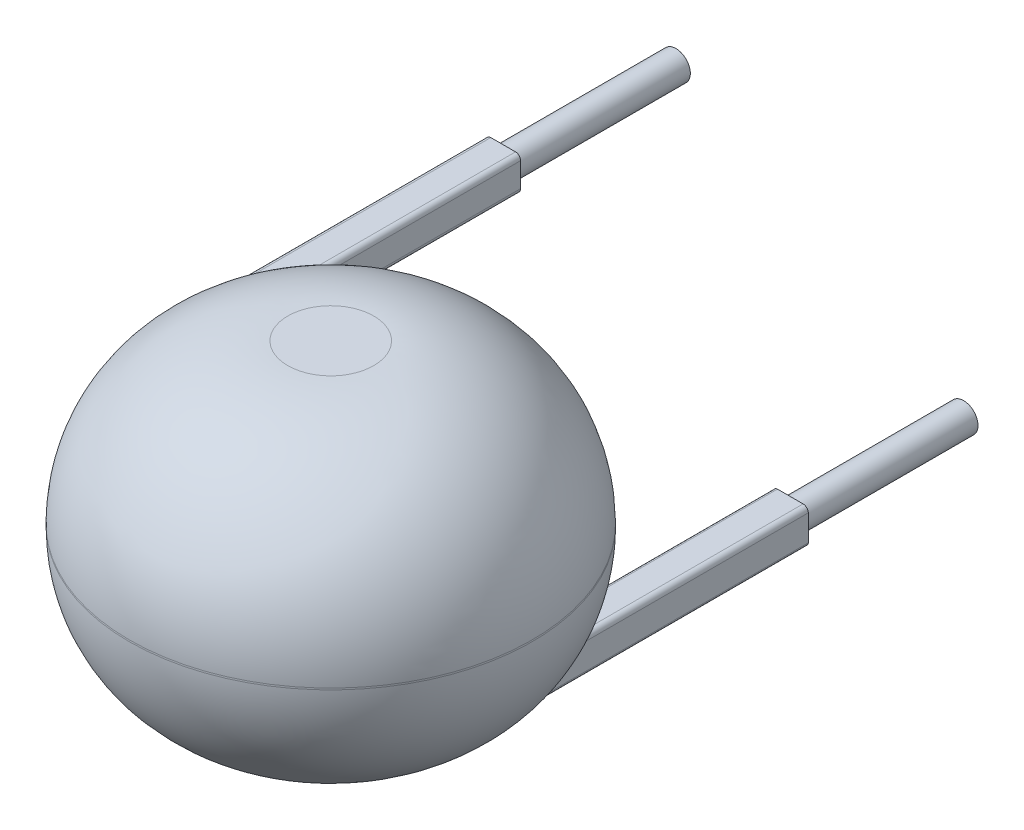
ISO-10303-21;
HEADER;
FILE_DESCRIPTION(('STEP AP214'),'2;1');
FILE_NAME('part.step','',(''),(''),'','','');
FILE_SCHEMA(('AUTOMOTIVE_DESIGN { 1 0 10303 214 1 1 1 1 }'));
ENDSEC;
DATA;
#1=APPLICATION_CONTEXT('core data for automotive mechanical design processes');
#2=APPLICATION_PROTOCOL_DEFINITION('international standard','automotive_design',2000,#1);
#3=PRODUCT_CONTEXT('',#1,'mechanical');
#4=PRODUCT('Part','Part','',(#3));
#5=PRODUCT_RELATED_PRODUCT_CATEGORY('part','',(#4));
#6=PRODUCT_DEFINITION_FORMATION('','',#4);
#7=PRODUCT_DEFINITION_CONTEXT('part definition',#1,'design');
#8=PRODUCT_DEFINITION('design','',#6,#7);
#9=PRODUCT_DEFINITION_SHAPE('','',#8);
#10=(LENGTH_UNIT() NAMED_UNIT(*) SI_UNIT(.MILLI.,.METRE.));
#11=(NAMED_UNIT(*) PLANE_ANGLE_UNIT() SI_UNIT($,.RADIAN.));
#12=(NAMED_UNIT(*) SI_UNIT($,.STERADIAN.) SOLID_ANGLE_UNIT());
#13=UNCERTAINTY_MEASURE_WITH_UNIT(LENGTH_MEASURE(1.E-05),#10,'distance_accuracy_value','');
#14=(GEOMETRIC_REPRESENTATION_CONTEXT(3) GLOBAL_UNCERTAINTY_ASSIGNED_CONTEXT((#13)) GLOBAL_UNIT_ASSIGNED_CONTEXT((#10,
#11,#12)) REPRESENTATION_CONTEXT('',''));
#15=CARTESIAN_POINT('',(0.,0.,0.));
#16=DIRECTION('',(0.,0.,1.));
#17=DIRECTION('',(1.,0.,0.));
#18=AXIS2_PLACEMENT_3D('',#15,#16,#17);
#19=CARTESIAN_POINT('',(2.265265,-1.1,3.));
#20=DIRECTION('',(0.,1.,0.));
#21=DIRECTION('',(0.,0.,1.));
#22=AXIS2_PLACEMENT_3D('',#19,#20,#21);
#23=PLANE('',#22);
#24=CARTESIAN_POINT('',(0.,-1.1,8.5));
#25=DIRECTION('',(0.,-1.,0.));
#26=DIRECTION('',(1.,0.,0.));
#27=AXIS2_PLACEMENT_3D('',#24,#25,#26);
#28=CIRCLE('',#27,3.28098746596916);
#29=CARTESIAN_POINT('',(2.26526500000004,-1.1,6.12651032620288));
#30=VERTEX_POINT('',#29);
#31=CARTESIAN_POINT('',(2.710115,-1.1,6.65063377379681));
#32=VERTEX_POINT('',#31);
#33=EDGE_CURVE('E19',#30,#32,#28,.T.);
#34=ORIENTED_EDGE('',*,*,#33,.T.);
#35=DIRECTION('',(0.,0.,-1.));
#36=VECTOR('',#35,1.);
#37=CARTESIAN_POINT('',(2.710115,-1.1,3.));
#38=LINE('',#37,#36);
#39=CARTESIAN_POINT('',(2.710115,-1.1,3.));
#40=VERTEX_POINT('',#39);
#41=EDGE_CURVE('E142',#40,#32,#38,.F.);
#42=ORIENTED_EDGE('',*,*,#41,.F.);
#43=DIRECTION('',(1.,0.,0.));
#44=VECTOR('',#43,1.);
#45=CARTESIAN_POINT('',(2.265265,-1.1,3.));
#46=LINE('',#45,#44);
#47=CARTESIAN_POINT('',(2.265265,-1.1,3.));
#48=VERTEX_POINT('',#47);
#49=EDGE_CURVE('E146',#40,#48,#46,.F.);
#50=ORIENTED_EDGE('',*,*,#49,.T.);
#51=DIRECTION('',(0.,0.,-1.));
#52=VECTOR('',#51,1.);
#53=CARTESIAN_POINT('',(2.265265,-1.1,3.));
#54=LINE('',#53,#52);
#55=EDGE_CURVE('E145',#30,#48,#54,.T.);
#56=ORIENTED_EDGE('',*,*,#55,.F.);
#57=EDGE_LOOP('',(#34,#42,#50,#56));
#58=FACE_BOUND('',#57,.T.);
#59=ADVANCED_FACE('F16',(#58),#23,.T.);
#60=CARTESIAN_POINT('',(2.75,-1.4,0.));
#61=DIRECTION('',(0.,0.,1.));
#62=DIRECTION('',(1.,0.,0.));
#63=AXIS2_PLACEMENT_3D('',#60,#61,#62);
#64=PLANE('',#63);
#65=CARTESIAN_POINT('',(2.5,-1.4,0.));
#66=DIRECTION('',(0.,0.,1.));
#67=DIRECTION('',(1.,0.,0.));
#68=AXIS2_PLACEMENT_3D('',#65,#66,#67);
#69=CIRCLE('',#68,0.25);
#70=CARTESIAN_POINT('',(2.75,-1.4,0.));
#71=VERTEX_POINT('',#70);
#72=EDGE_CURVE('E594',#71,#71,#69,.T.);
#73=ORIENTED_EDGE('',*,*,#72,.F.);
#74=EDGE_LOOP('',(#73));
#75=FACE_BOUND('',#74,.T.);
#76=ADVANCED_FACE('F548',(#75),#64,.F.);
#77=CARTESIAN_POINT('',(2.710115,-1.189885,3.));
#78=DIRECTION('',(0.,0.,-1.));
#79=DIRECTION('',(-1.,0.,0.));
#80=AXIS2_PLACEMENT_3D('',#77,#78,#79);
#81=CYLINDRICAL_SURFACE('',#80,0.089885);
#82=DIRECTION('',(0.,0.,-1.));
#83=VECTOR('',#82,1.);
#84=CARTESIAN_POINT('',(2.8,-1.189885,3.));
#85=LINE('',#84,#83);
#86=CARTESIAN_POINT('',(2.8,-1.189885,3.));
#87=VERTEX_POINT('',#86);
#88=CARTESIAN_POINT('',(2.8,-1.18988500000005,6.86857842440395));
#89=VERTEX_POINT('',#88);
#90=EDGE_CURVE('E597',#87,#89,#85,.F.);
#91=ORIENTED_EDGE('',*,*,#90,.F.);
#92=CARTESIAN_POINT('',(2.710115,-1.189885,3.));
#93=DIRECTION('',(0.,0.,-1.));
#94=DIRECTION('',(-1.,0.,0.));
#95=AXIS2_PLACEMENT_3D('',#92,#93,#94);
#96=CIRCLE('',#95,0.089885);
#97=EDGE_CURVE('E141',#87,#40,#96,.F.);
#98=ORIENTED_EDGE('',*,*,#97,.T.);
#99=ORIENTED_EDGE('',*,*,#41,.T.);
#100=CARTESIAN_POINT('',(2.71011500000017,-1.1,6.65063377379688));
#101=CARTESIAN_POINT('',(2.71498028899243,-1.10000774236478,6.6577694744777));
#102=CARTESIAN_POINT('',(2.71967655665813,-1.10039388554111,6.66500484150084));
#103=CARTESIAN_POINT('',(2.7287413549297,-1.10182979718225,6.67961959139926));
#104=CARTESIAN_POINT('',(2.73310974726967,-1.10287984387745,6.68699903339666));
#105=CARTESIAN_POINT('',(2.74706667791884,-1.10730872404726,6.71161397500613));
#106=CARTESIAN_POINT('',(2.75595295442842,-1.11193325680277,6.72902993672954));
#107=CARTESIAN_POINT('',(2.77190961848127,-1.12384894087521,6.76388076281297));
#108=CARTESIAN_POINT('',(2.77897320013423,-1.13114984702747,6.78131546070197));
#109=CARTESIAN_POINT('',(2.78805226360753,-1.14473766152052,6.80781575464605));
#110=CARTESIAN_POINT('',(2.79090958566138,-1.15000486169995,6.81712011583291));
#111=CARTESIAN_POINT('',(2.79565404013966,-1.16157150091445,6.83526444914789));
#112=CARTESIAN_POINT('',(2.79754873827161,-1.16786236056528,6.84410753649104));
#113=CARTESIAN_POINT('',(2.79912683320544,-1.17716883805135,6.85529602436851));
#114=CARTESIAN_POINT('',(2.79944293226079,-1.179581668201,6.85805294304374));
#115=CARTESIAN_POINT('',(2.79987919894188,-1.18459149551493,6.86343162269824));
#116=CARTESIAN_POINT('',(2.79999852120719,-1.18718923752436,6.86605275391414));
#117=CARTESIAN_POINT('',(2.8,-1.18988500000009,6.8685784244039));
#118=B_SPLINE_CURVE_WITH_KNOTS('',3,(#100,#101,#102,#103,#104,#105,#106,#107,#108,#109,#110,
#111,#112,#113,#114,#115,#116,#117),.UNSPECIFIED.,.F.,.F.,(4,2,2,2,2,2,2,2,4),(0.,
0.0258792798324099,0.0517694124150034,0.111757943384605,0.17196733027596,0.205108797888413,
0.237985597659175,0.249006765659486,0.260075158826563),.UNSPECIFIED.);
#119=EDGE_CURVE('E130',#32,#89,#118,.T.);
#120=ORIENTED_EDGE('',*,*,#119,.T.);
#121=EDGE_LOOP('',(#91,#98,#99,#120));
#122=FACE_BOUND('',#121,.T.);
#123=ADVANCED_FACE('F148',(#122),#81,.T.);
#124=CARTESIAN_POINT('',(2.265265,-1.165265,3.));
#125=DIRECTION('',(0.,0.,-1.));
#126=DIRECTION('',(-1.,0.,0.));
#127=AXIS2_PLACEMENT_3D('',#124,#125,#126);
#128=CYLINDRICAL_SURFACE('',#127,0.065265);
#129=ORIENTED_EDGE('',*,*,#55,.T.);
#130=CARTESIAN_POINT('',(2.265265,-1.165265,3.));
#131=DIRECTION('',(0.,0.,-1.));
#132=DIRECTION('',(-1.,0.,0.));
#133=AXIS2_PLACEMENT_3D('',#130,#131,#132);
#134=CIRCLE('',#133,0.065265);
#135=CARTESIAN_POINT('',(2.2,-1.165265,3.));
#136=VERTEX_POINT('',#135);
#137=EDGE_CURVE('E592',#48,#136,#134,.F.);
#138=ORIENTED_EDGE('',*,*,#137,.T.);
#139=DIRECTION('',(0.,0.,1.));
#140=VECTOR('',#139,1.);
#141=CARTESIAN_POINT('',(2.2,-1.165265,3.));
#142=LINE('',#141,#140);
#143=CARTESIAN_POINT('',(2.2,-1.16526500000006,6.10502936180291));
#144=VERTEX_POINT('',#143);
#145=EDGE_CURVE('E616',#144,#136,#142,.F.);
#146=ORIENTED_EDGE('',*,*,#145,.F.);
#147=CARTESIAN_POINT('',(2.2,-1.16526500000006,6.10502936180291));
#148=CARTESIAN_POINT('',(2.20000376487046,-1.16274013195119,6.10345904064927));
#149=CARTESIAN_POINT('',(2.20014824976992,-1.16015268425273,6.10198598403389));
#150=CARTESIAN_POINT('',(2.20077763472524,-1.15485766390405,6.09929218758634));
#151=CARTESIAN_POINT('',(2.20126601522262,-1.1521491305522,6.09807419409444));
#152=CARTESIAN_POINT('',(2.20333329648783,-1.14393202602417,6.09493875443286));
#153=CARTESIAN_POINT('',(2.20551427994999,-1.13833064077663,6.09353897994534));
#154=CARTESIAN_POINT('',(2.21107687070535,-1.12850833105889,6.09273161070589));
#155=CARTESIAN_POINT('',(2.21427575760491,-1.12420235806372,6.09309821754573));
#156=CARTESIAN_POINT('',(2.22114159297263,-1.11693104259928,6.09510210778626));
#157=CARTESIAN_POINT('',(2.22476205998835,-1.11389456393198,6.09665149244309));
#158=CARTESIAN_POINT('',(2.23392463518142,-1.10763382093287,6.10145562522214));
#159=CARTESIAN_POINT('',(2.23958120174379,-1.10497197061525,6.10516765419074));
#160=CARTESIAN_POINT('',(2.25212346216473,-1.10092938714992,6.1145667053594));
#161=CARTESIAN_POINT('',(2.25898279158584,-1.1000016940251,6.12051329167096));
#162=CARTESIAN_POINT('',(2.26526500000008,-1.1,6.12651032620292));
#163=B_SPLINE_CURVE_WITH_KNOTS('',3,(#147,#148,#149,#150,#151,#152,#153,#154,#155,#156,#157,
#158,#159,#160,#161,#162),.UNSPECIFIED.,.F.,.F.,(4,2,2,2,2,2,2,4),(0.,0.00891247334995725,
0.0179164676881911,0.0359199483003887,0.0516878115099389,0.0663858775080399,0.0878803583042248,
0.114468200792033),.UNSPECIFIED.);
#164=EDGE_CURVE('E125',#144,#30,#163,.T.);
#165=ORIENTED_EDGE('',*,*,#164,.T.);
#166=EDGE_LOOP('',(#129,#138,#146,#165));
#167=FACE_BOUND('',#166,.T.);
#168=ADVANCED_FACE('F531',(#167),#128,.T.);
#169=CARTESIAN_POINT('',(2.5,-1.4,3.));
#170=DIRECTION('',(0.,0.,1.));
#171=DIRECTION('',(1.,0.,0.));
#172=AXIS2_PLACEMENT_3D('',#169,#170,#171);
#173=CYLINDRICAL_SURFACE('',#172,0.25);
#174=ORIENTED_EDGE('',*,*,#72,.T.);
#175=EDGE_LOOP('',(#174));
#176=FACE_BOUND('',#175,.T.);
#177=CARTESIAN_POINT('',(2.5,-1.4,3.));
#178=DIRECTION('',(0.,0.,1.));
#179=DIRECTION('',(1.,0.,0.));
#180=AXIS2_PLACEMENT_3D('',#177,#178,#179);
#181=CIRCLE('',#180,0.25);
#182=CARTESIAN_POINT('',(2.75,-1.4,3.));
#183=VERTEX_POINT('',#182);
#184=EDGE_CURVE('E619',#183,#183,#181,.F.);
#185=ORIENTED_EDGE('',*,*,#184,.T.);
#186=EDGE_LOOP('',(#185));
#187=FACE_BOUND('',#186,.T.);
#188=ADVANCED_FACE('F522',(#176,#187),#173,.T.);
#189=CARTESIAN_POINT('',(2.8,-1.189885,3.));
#190=DIRECTION('',(1.,0.,0.));
#191=DIRECTION('',(0.,0.,-1.));
#192=AXIS2_PLACEMENT_3D('',#189,#190,#191);
#193=PLANE('',#192);
#194=CARTESIAN_POINT('',(2.8,-1.18988500000009,6.8685784244039));
#195=CARTESIAN_POINT('',(2.8,-1.21389777419375,6.89105251008016));
#196=CARTESIAN_POINT('',(2.8,-1.23730896775835,6.91416632418309));
#197=CARTESIAN_POINT('',(2.8,-1.2827256123761,6.96141182533229));
#198=CARTESIAN_POINT('',(2.8,-1.30474009612783,6.98553482676566));
#199=CARTESIAN_POINT('',(2.8,-1.34741313636841,7.03475331148148));
#200=CARTESIAN_POINT('',(2.8,-1.36807755138349,7.05984372045196));
#201=CARTESIAN_POINT('',(2.8,-1.40809219939328,7.11096101029188));
#202=CARTESIAN_POINT('',(2.8,-1.42744524833589,7.13698568827555));
#203=CARTESIAN_POINT('',(2.8,-1.46486063062107,7.18993117717473));
#204=CARTESIAN_POINT('',(2.8,-1.482923457763,7.21685163940647));
#205=CARTESIAN_POINT('',(2.8,-1.51779737860161,7.27158688294801));
#206=CARTESIAN_POINT('',(2.8,-1.53460518602446,7.29940375669741));
#207=CARTESIAN_POINT('',(2.8,-1.56698666843713,7.35592171053858));
#208=CARTESIAN_POINT('',(2.8,-1.58255409995758,7.38462636393254));
#209=CARTESIAN_POINT('',(2.8,-1.6124650041933,7.4429158076398));
#210=CARTESIAN_POINT('',(2.8,-1.62679934686158,7.47250528523241));
#211=CARTESIAN_POINT('',(2.8,-1.64045999999997,7.50240082354201));
#212=B_SPLINE_CURVE_WITH_KNOTS('',3,(#194,#195,#196,#197,#198,#199,#200,#201,#202,#203,#204,
#205,#206,#207,#208,#209,#210,#211),.UNSPECIFIED.,.F.,.F.,(4,2,2,2,2,2,2,2,4),(0.,
0.0986527756327957,0.196583682872479,0.294056702954718,0.391313308507406,0.488532489899086,
0.585997908682367,0.683926436040435,0.782526827517283),.UNSPECIFIED.);
#213=CARTESIAN_POINT('',(2.8,-1.64045999999998,7.50240082354201));
#214=VERTEX_POINT('',#213);
#215=EDGE_CURVE('E136',#89,#214,#212,.T.);
#216=ORIENTED_EDGE('',*,*,#215,.T.);
#217=DIRECTION('',(0.,0.,-1.));
#218=VECTOR('',#217,1.);
#219=CARTESIAN_POINT('',(2.8,-1.64046,3.));
#220=LINE('',#219,#218);
#221=CARTESIAN_POINT('',(2.8,-1.64046,3.));
#222=VERTEX_POINT('',#221);
#223=EDGE_CURVE('E621',#222,#214,#220,.F.);
#224=ORIENTED_EDGE('',*,*,#223,.F.);
#225=DIRECTION('',(0.,1.,0.));
#226=VECTOR('',#225,1.);
#227=CARTESIAN_POINT('',(2.8,-1.617055,3.));
#228=LINE('',#227,#226);
#229=EDGE_CURVE('E622',#222,#87,#228,.T.);
#230=ORIENTED_EDGE('',*,*,#229,.T.);
#231=ORIENTED_EDGE('',*,*,#90,.T.);
#232=EDGE_LOOP('',(#216,#224,#230,#231));
#233=FACE_BOUND('',#232,.T.);
#234=ADVANCED_FACE('F513',(#233),#193,.T.);
#235=CARTESIAN_POINT('',(2.2,-1.617055,3.));
#236=DIRECTION('',(-1.,0.,0.));
#237=DIRECTION('',(0.,0.,1.));
#238=AXIS2_PLACEMENT_3D('',#235,#236,#237);
#239=PLANE('',#238);
#240=CARTESIAN_POINT('',(2.2,-1.61705499999995,6.47600648003105));
#241=CARTESIAN_POINT('',(2.2,-1.59464872818816,6.45223729910033));
#242=CARTESIAN_POINT('',(2.2,-1.57174676819976,6.42893439388173));
#243=CARTESIAN_POINT('',(2.2,-1.52506726062348,6.38339648622144));
#244=CARTESIAN_POINT('',(2.2,-1.50129320145172,6.36115790723338));
#245=CARTESIAN_POINT('',(2.2,-1.45286701663498,6.31775084474858));
#246=CARTESIAN_POINT('',(2.2,-1.42821661191346,6.29658044222312));
#247=CARTESIAN_POINT('',(2.2,-1.37802993183403,6.25531410887796));
#248=CARTESIAN_POINT('',(2.2,-1.35249361088064,6.23521823349666));
#249=CARTESIAN_POINT('',(2.2,-1.30052762836661,6.19611501529311));
#250=CARTESIAN_POINT('',(2.2,-1.27409642748129,6.17710971730867));
#251=CARTESIAN_POINT('',(2.2,-1.22032847890549,6.1402048956233));
#252=CARTESIAN_POINT('',(2.2,-1.19298873156848,6.12230974273837));
#253=CARTESIAN_POINT('',(2.2,-1.16526500000006,6.10502936180291));
#254=B_SPLINE_CURVE_WITH_KNOTS('',3,(#240,#241,#242,#243,#244,#245,#246,#247,#248,#249,#250,
#251,#252,#253),.UNSPECIFIED.,.F.,.F.,(4,2,2,2,2,2,4),(0.,0.0979895673857979,0.195622656247312,
0.29307359497029,0.390529556667489,0.488162648521882,0.586158491795375),.UNSPECIFIED.);
#255=CARTESIAN_POINT('',(2.2,-1.61705499999995,6.47600648003105));
#256=VERTEX_POINT('',#255);
#257=EDGE_CURVE('E602',#256,#144,#254,.T.);
#258=ORIENTED_EDGE('',*,*,#257,.T.);
#259=ORIENTED_EDGE('',*,*,#145,.T.);
#260=DIRECTION('',(0.,1.,0.));
#261=VECTOR('',#260,1.);
#262=CARTESIAN_POINT('',(2.2,-1.617055,3.));
#263=LINE('',#262,#261);
#264=CARTESIAN_POINT('',(2.2,-1.617055,3.));
#265=VERTEX_POINT('',#264);
#266=EDGE_CURVE('E618',#136,#265,#263,.F.);
#267=ORIENTED_EDGE('',*,*,#266,.T.);
#268=DIRECTION('',(0.,0.,-1.));
#269=VECTOR('',#268,1.);
#270=CARTESIAN_POINT('',(2.2,-1.617055,3.));
#271=LINE('',#270,#269);
#272=EDGE_CURVE('E296',#256,#265,#271,.T.);
#273=ORIENTED_EDGE('',*,*,#272,.F.);
#274=EDGE_LOOP('',(#258,#259,#267,#273));
#275=FACE_BOUND('',#274,.T.);
#276=ADVANCED_FACE('F504',(#275),#239,.T.);
#277=CARTESIAN_POINT('',(-2.288255,1.611745,3.));
#278=DIRECTION('',(0.,0.,-1.));
#279=DIRECTION('',(-1.,0.,0.));
#280=AXIS2_PLACEMENT_3D('',#277,#278,#279);
#281=CYLINDRICAL_SURFACE('',#280,0.088255);
#282=DIRECTION('',(0.,0.,-1.));
#283=VECTOR('',#282,1.);
#284=CARTESIAN_POINT('',(-2.2,1.611745,3.));
#285=LINE('',#284,#283);
#286=CARTESIAN_POINT('',(-2.2,1.611745,3.));
#287=VERTEX_POINT('',#286);
#288=CARTESIAN_POINT('',(-2.2,1.61174499999993,6.49452209743907));
#289=VERTEX_POINT('',#288);
#290=EDGE_CURVE('E272',#287,#289,#285,.F.);
#291=ORIENTED_EDGE('',*,*,#290,.F.);
#292=CARTESIAN_POINT('',(-2.288255,1.611745,3.));
#293=DIRECTION('',(0.,0.,-1.));
#294=DIRECTION('',(-1.,0.,0.));
#295=AXIS2_PLACEMENT_3D('',#292,#293,#294);
#296=CIRCLE('',#295,0.088255);
#297=CARTESIAN_POINT('',(-2.288255,1.7,3.));
#298=VERTEX_POINT('',#297);
#299=EDGE_CURVE('E615',#287,#298,#296,.F.);
#300=ORIENTED_EDGE('',*,*,#299,.T.);
#301=DIRECTION('',(0.,0.,1.));
#302=VECTOR('',#301,1.);
#303=CARTESIAN_POINT('',(-2.288255,1.7,3.));
#304=LINE('',#303,#302);
#305=CARTESIAN_POINT('',(-2.28825499999991,1.7,6.70181499168424));
#306=VERTEX_POINT('',#305);
#307=EDGE_CURVE('E264',#306,#298,#304,.F.);
#308=ORIENTED_EDGE('',*,*,#307,.F.);
#309=CARTESIAN_POINT('',(-2.28825499999983,1.7,6.70181499168413));
#310=CARTESIAN_POINT('',(-2.2842169162784,1.69999370844753,6.69666843342328));
#311=CARTESIAN_POINT('',(-2.28033142682719,1.69972333475055,6.69141513974095));
#312=CARTESIAN_POINT('',(-2.27284583291342,1.69872769649531,6.68076338510658));
#313=CARTESIAN_POINT('',(-2.26924522755354,1.69800325126946,6.67536520235135));
#314=CARTESIAN_POINT('',(-2.25879344772087,1.69524960508854,6.65898490118958));
#315=CARTESIAN_POINT('',(-2.25232302317821,1.69264124953135,6.64785759175315));
#316=CARTESIAN_POINT('',(-2.23794709633367,1.68488073545512,6.62105398121976));
#317=CARTESIAN_POINT('',(-2.23048333682712,1.67913086846084,6.60531587171817));
#318=CARTESIAN_POINT('',(-2.21752607050174,1.66536895775458,6.57403756620356));
#319=CARTESIAN_POINT('',(-2.21202847470414,1.65736167153303,6.5584970250413));
#320=CARTESIAN_POINT('',(-2.20539956361948,1.64271859787688,6.5344721441127));
#321=CARTESIAN_POINT('',(-2.20340327212462,1.63689809159988,6.52574193694092));
#322=CARTESIAN_POINT('',(-2.2007678447801,1.62474405372874,6.50942668909913));
#323=CARTESIAN_POINT('',(-2.20004089485931,1.6184782003612,6.50180450226524));
#324=CARTESIAN_POINT('',(-2.2,1.61174499999985,6.49452209743914));
#325=B_SPLINE_CURVE_WITH_KNOTS('',3,(#309,#310,#311,#312,#313,#314,#315,#316,#317,#318,#319,
#320,#321,#322,#323,#324),.UNSPECIFIED.,.F.,.F.,(4,2,2,2,2,2,2,4),(0.,0.0196018562842176,
0.0391684441542346,0.0784526746346677,0.133244026301339,0.187920757991797,0.219850773310597,
0.249468455120291),.UNSPECIFIED.);
#326=EDGE_CURVE('E610',#306,#289,#325,.T.);
#327=ORIENTED_EDGE('',*,*,#326,.T.);
#328=EDGE_LOOP('',(#291,#300,#308,#327));
#329=FACE_BOUND('',#328,.T.);
#330=ADVANCED_FACE('F496',(#329),#281,.T.);
#331=CARTESIAN_POINT('',(2.2,-1.617055,3.));
#332=DIRECTION('',(0.,0.,1.));
#333=DIRECTION('',(1.,0.,0.));
#334=AXIS2_PLACEMENT_3D('',#331,#332,#333);
#335=PLANE('',#334);
#336=ORIENTED_EDGE('',*,*,#184,.F.);
#337=EDGE_LOOP('',(#336));
#338=FACE_BOUND('',#337,.T.);
#339=ORIENTED_EDGE('',*,*,#49,.F.);
#340=ORIENTED_EDGE('',*,*,#97,.F.);
#341=ORIENTED_EDGE('',*,*,#229,.F.);
#342=CARTESIAN_POINT('',(2.74046,-1.64046,3.));
#343=DIRECTION('',(0.,0.,-1.));
#344=DIRECTION('',(-1.,0.,0.));
#345=AXIS2_PLACEMENT_3D('',#342,#343,#344);
#346=CIRCLE('',#345,0.05954);
#347=CARTESIAN_POINT('',(2.74046,-1.7,3.));
#348=VERTEX_POINT('',#347);
#349=EDGE_CURVE('E297',#348,#222,#346,.F.);
#350=ORIENTED_EDGE('',*,*,#349,.F.);
#351=DIRECTION('',(1.,0.,0.));
#352=VECTOR('',#351,1.);
#353=CARTESIAN_POINT('',(2.74046,-1.7,3.));
#354=LINE('',#353,#352);
#355=CARTESIAN_POINT('',(2.282945,-1.7,3.));
#356=VERTEX_POINT('',#355);
#357=EDGE_CURVE('E319',#356,#348,#354,.T.);
#358=ORIENTED_EDGE('',*,*,#357,.F.);
#359=CARTESIAN_POINT('',(2.282945,-1.617055,3.));
#360=DIRECTION('',(0.,0.,-1.));
#361=DIRECTION('',(-1.,0.,0.));
#362=AXIS2_PLACEMENT_3D('',#359,#360,#361);
#363=CIRCLE('',#362,0.082945);
#364=EDGE_CURVE('E273',#265,#356,#363,.F.);
#365=ORIENTED_EDGE('',*,*,#364,.F.);
#366=ORIENTED_EDGE('',*,*,#266,.F.);
#367=ORIENTED_EDGE('',*,*,#137,.F.);
#368=EDGE_LOOP('',(#339,#340,#341,#350,#358,#365,#366,#367));
#369=FACE_BOUND('',#368,.T.);
#370=ADVANCED_FACE('F488',(#338,#369),#335,.F.);
#371=CARTESIAN_POINT('',(2.74046,-1.64046,3.));
#372=DIRECTION('',(0.,0.,-1.));
#373=DIRECTION('',(-1.,0.,0.));
#374=AXIS2_PLACEMENT_3D('',#371,#372,#373);
#375=CYLINDRICAL_SURFACE('',#374,0.05954);
#376=DIRECTION('',(0.,0.,-1.));
#377=VECTOR('',#376,1.);
#378=CARTESIAN_POINT('',(2.74046,-1.7,3.));
#379=LINE('',#378,#377);
#380=CARTESIAN_POINT('',(2.74045999998149,-1.70000000005333,7.47063697098672));
#381=VERTEX_POINT('',#380);
#382=EDGE_CURVE('E316',#348,#381,#379,.F.);
#383=ORIENTED_EDGE('',*,*,#382,.F.);
#384=ORIENTED_EDGE('',*,*,#349,.T.);
#385=ORIENTED_EDGE('',*,*,#223,.T.);
#386=CARTESIAN_POINT('',(2.8,-1.64045999999997,7.50240082354201));
#387=CARTESIAN_POINT('',(2.79999028540072,-1.64230609812044,7.50641357115442));
#388=CARTESIAN_POINT('',(2.79991306549413,-1.64421715778437,7.51041107849383));
#389=CARTESIAN_POINT('',(2.79952196748366,-1.64828935282251,7.51835655189094));
#390=CARTESIAN_POINT('',(2.79920372602264,-1.65045446943878,7.52230222347402));
#391=CARTESIAN_POINT('',(2.79838668588854,-1.65431403540948,7.52868195336391));
#392=CARTESIAN_POINT('',(2.79798439333031,-1.6559224187334,7.53117872110783));
#393=CARTESIAN_POINT('',(2.79696253778085,-1.65931820393194,7.53598548646667));
#394=CARTESIAN_POINT('',(2.79634418176114,-1.66110457271528,7.53829643565699));
#395=CARTESIAN_POINT('',(2.79483397818248,-1.66479541579942,7.54242867714981));
#396=CARTESIAN_POINT('',(2.79396577030927,-1.6666813522126,7.54427355544551));
#397=CARTESIAN_POINT('',(2.79195569200982,-1.67040727320549,7.54708657615519));
#398=CARTESIAN_POINT('',(2.79088191730112,-1.67220420940589,7.5481488169968));
#399=CARTESIAN_POINT('',(2.78864426342102,-1.67547765979329,7.54927936977406));
#400=CARTESIAN_POINT('',(2.78755097721875,-1.67693869461315,7.54951380029317));
#401=CARTESIAN_POINT('',(2.78525154063617,-1.67972857813527,7.54935411952921));
#402=CARTESIAN_POINT('',(2.78404535145114,-1.68105738106335,7.54895979138988));
#403=CARTESIAN_POINT('',(2.78118149041442,-1.68396328924577,7.54745058642589));
#404=CARTESIAN_POINT('',(2.77953809629589,-1.68542413077014,7.54610911678873));
#405=CARTESIAN_POINT('',(2.77513366209198,-1.68900394697551,7.54175306011404));
#406=CARTESIAN_POINT('',(2.77255219310208,-1.69069022112626,7.53826554850628));
#407=CARTESIAN_POINT('',(2.76633770855289,-1.69425782850905,7.5287994042019));
#408=CARTESIAN_POINT('',(2.76295160091484,-1.6956955719553,7.52253989056005));
#409=CARTESIAN_POINT('',(2.75657566208566,-1.697872193466,7.5096801347354));
#410=CARTESIAN_POINT('',(2.75358849176843,-1.69860656273239,7.50307797658148));
#411=CARTESIAN_POINT('',(2.74891670731945,-1.69942540380026,7.4921292876263));
#412=CARTESIAN_POINT('',(2.74715030706782,-1.69964866397992,7.48782636135044));
#413=CARTESIAN_POINT('',(2.74373160734766,-1.69993391981429,7.47923161388604));
#414=CARTESIAN_POINT('',(2.74207816499964,-1.69999788000431,7.47494031611134));
#415=CARTESIAN_POINT('',(2.74045999996299,-1.70000000010666,7.47063697099643));
#416=B_SPLINE_CURVE_WITH_KNOTS('',3,(#386,#387,#388,#389,#390,#391,#392,#393,#394,#395,#396,
#397,#398,#399,#400,#401,#402,#403,#404,#405,#406,#407,#408,#409,#410,#411,#412,#413,#414,#415),
.UNSPECIFIED.,.F.,.F.,(4,2,2,2,2,2,2,2,2,2,2,2,2,2,4),(0.,0.0132718733878705,0.0267899354367943,
0.0357689897106592,0.0446986666876735,0.0529671758774046,0.0598816678722654,0.0652897901566685,
0.0706997780835432,0.0782934071561976,0.0920703386586912,0.11375496637453,0.135577685450873,
0.149544307121525,0.163337815893382),.UNSPECIFIED.);
#417=EDGE_CURVE('E623',#214,#381,#416,.T.);
#418=ORIENTED_EDGE('',*,*,#417,.T.);
#419=EDGE_LOOP('',(#383,#384,#385,#418));
#420=FACE_BOUND('',#419,.T.);
#421=ADVANCED_FACE('F287',(#420),#375,.T.);
#422=CARTESIAN_POINT('',(2.282945,-1.617055,3.));
#423=DIRECTION('',(0.,0.,-1.));
#424=DIRECTION('',(-1.,0.,0.));
#425=AXIS2_PLACEMENT_3D('',#422,#423,#424);
#426=CYLINDRICAL_SURFACE('',#425,0.082945);
#427=ORIENTED_EDGE('',*,*,#272,.T.);
#428=ORIENTED_EDGE('',*,*,#364,.T.);
#429=DIRECTION('',(0.,0.,-1.));
#430=VECTOR('',#429,1.);
#431=CARTESIAN_POINT('',(2.282945,-1.7,3.));
#432=LINE('',#431,#430);
#433=CARTESIAN_POINT('',(2.28294499999996,-1.7,6.66755044159612));
#434=VERTEX_POINT('',#433);
#435=EDGE_CURVE('E313',#434,#356,#432,.T.);
#436=ORIENTED_EDGE('',*,*,#435,.F.);
#437=CARTESIAN_POINT('',(2.28294499999992,-1.7,6.66755044159607));
#438=CARTESIAN_POINT('',(2.27920001200012,-1.69999450134888,6.66287799942817));
#439=CARTESIAN_POINT('',(2.27559354320723,-1.69974680414438,6.6581064717339));
#440=CARTESIAN_POINT('',(2.26864114936495,-1.69883367856933,6.64842766361026));
#441=CARTESIAN_POINT('',(2.26529476354305,-1.6981690088012,6.64352064514591));
#442=CARTESIAN_POINT('',(2.25555574480594,-1.695635739936,6.62859337240571));
#443=CARTESIAN_POINT('',(2.24951561567545,-1.69322979264291,6.61843452472146));
#444=CARTESIAN_POINT('',(2.23607460512304,-1.68606253777363,6.59392590808958));
#445=CARTESIAN_POINT('',(2.2290866308992,-1.68074520284787,6.57951476371133));
#446=CARTESIAN_POINT('',(2.21693938162769,-1.66804747306015,6.55088433115447));
#447=CARTESIAN_POINT('',(2.21177297593952,-1.66067532960749,6.53666450927761));
#448=CARTESIAN_POINT('',(2.20546976673655,-1.64718231271549,6.51460403886604));
#449=CARTESIAN_POINT('',(2.20354957707668,-1.64179392723569,6.50654517831006));
#450=CARTESIAN_POINT('',(2.20150182551199,-1.63305101040946,6.49478497874154));
#451=CARTESIAN_POINT('',(2.20095785167373,-1.63002276211033,6.49091530890747));
#452=CARTESIAN_POINT('',(2.20020844552686,-1.62372377249483,6.48332994842782));
#453=CARTESIAN_POINT('',(2.20000382451781,-1.62045246953405,6.47961464743035));
#454=CARTESIAN_POINT('',(2.19999999999992,-1.61705499999998,6.47600648003104));
#455=B_SPLINE_CURVE_WITH_KNOTS('',3,(#437,#438,#439,#440,#441,#442,#443,#444,#445,#446,#447,
#448,#449,#450,#451,#452,#453,#454),.UNSPECIFIED.,.F.,.F.,(4,2,2,2,2,2,2,2,4),(0.,
0.0179429952582272,0.0358534409370209,0.0719282280813417,0.122336745732487,0.172545686177613,
0.20210361808719,0.2169168911446,0.231765527891524),.UNSPECIFIED.);
#456=EDGE_CURVE('E291',#434,#256,#455,.T.);
#457=ORIENTED_EDGE('',*,*,#456,.T.);
#458=EDGE_LOOP('',(#427,#428,#436,#457));
#459=FACE_BOUND('',#458,.T.);
#460=ADVANCED_FACE('F281',(#459),#426,.T.);
#461=CARTESIAN_POINT('',(-2.2,1.611745,3.));
#462=DIRECTION('',(1.,0.,0.));
#463=DIRECTION('',(0.,0.,-1.));
#464=AXIS2_PLACEMENT_3D('',#461,#462,#463);
#465=PLANE('',#464);
#466=CARTESIAN_POINT('',(-2.2,1.61174499999985,6.49452209743914));
#467=CARTESIAN_POINT('',(-2.2,1.59077951354796,6.47198723053476));
#468=CARTESIAN_POINT('',(-2.2,1.56937576934646,6.44985935990374));
#469=CARTESIAN_POINT('',(-2.2,1.52578548950858,6.40652899221903));
#470=CARTESIAN_POINT('',(-2.2,1.50360163666783,6.38532379584292));
#471=CARTESIAN_POINT('',(-2.2,1.45844873218194,6.3438409474617));
#472=CARTESIAN_POINT('',(-2.2,1.43548100624017,6.32356185303419));
#473=CARTESIAN_POINT('',(-2.2,1.38875388836523,6.28393503313624));
#474=CARTESIAN_POINT('',(-2.2,1.36499446377286,6.26458734616895));
#475=CARTESIAN_POINT('',(-2.2,1.31667761217894,6.22683451660046));
#476=CARTESIAN_POINT('',(-2.2,1.2921189865611,6.20843090747337));
#477=CARTESIAN_POINT('',(-2.2,1.24219374554208,6.17257977806516));
#478=CARTESIAN_POINT('',(-2.2,1.21682478530322,6.1551355234765));
#479=CARTESIAN_POINT('',(-2.2,1.19110700000015,6.13822070614978));
#480=B_SPLINE_CURVE_WITH_KNOTS('',3,(#466,#467,#468,#469,#470,#471,#472,#473,#474,#475,#476,
#477,#478,#479),.UNSPECIFIED.,.F.,.F.,(4,2,2,2,2,2,4),(0.,0.0923332125503673,0.184375110269117,
0.276268387519773,0.368165460261128,0.460207359938861,0.552545315067612),.UNSPECIFIED.);
#481=CARTESIAN_POINT('',(-2.2,1.19110700000007,6.13822070614989));
#482=VERTEX_POINT('',#481);
#483=EDGE_CURVE('E266',#289,#482,#480,.T.);
#484=ORIENTED_EDGE('',*,*,#483,.T.);
#485=DIRECTION('',(0.,0.,-1.));
#486=VECTOR('',#485,1.);
#487=CARTESIAN_POINT('',(-2.2,1.191107,3.));
#488=LINE('',#487,#486);
#489=CARTESIAN_POINT('',(-2.2,1.191107,3.));
#490=VERTEX_POINT('',#489);
#491=EDGE_CURVE('E260',#490,#482,#488,.F.);
#492=ORIENTED_EDGE('',*,*,#491,.F.);
#493=DIRECTION('',(0.,1.,0.));
#494=VECTOR('',#493,1.);
#495=CARTESIAN_POINT('',(-2.2,1.611745,3.));
#496=LINE('',#495,#494);
#497=EDGE_CURVE('E660',#490,#287,#496,.T.);
#498=ORIENTED_EDGE('',*,*,#497,.T.);
#499=ORIENTED_EDGE('',*,*,#290,.T.);
#500=EDGE_LOOP('',(#484,#492,#498,#499));
#501=FACE_BOUND('',#500,.T.);
#502=ADVANCED_FACE('F275',(#501),#465,.T.);
#503=CARTESIAN_POINT('',(-2.718763,1.7,3.));
#504=DIRECTION('',(0.,1.,0.));
#505=DIRECTION('',(0.,0.,1.));
#506=AXIS2_PLACEMENT_3D('',#503,#504,#505);
#507=PLANE('',#506);
#508=CARTESIAN_POINT('',(0.,1.7,8.5));
#509=DIRECTION('',(0.,-1.,0.));
#510=DIRECTION('',(1.,0.,0.));
#511=AXIS2_PLACEMENT_3D('',#508,#509,#510);
#512=CIRCLE('',#511,2.9102543306653);
#513=CARTESIAN_POINT('',(-2.71876299999849,1.70000000000398,7.46177650817071));
#514=VERTEX_POINT('',#513);
#515=EDGE_CURVE('E261',#514,#306,#512,.T.);
#516=ORIENTED_EDGE('',*,*,#515,.T.);
#517=ORIENTED_EDGE('',*,*,#307,.T.);
#518=DIRECTION('',(1.,0.,0.));
#519=VECTOR('',#518,1.);
#520=CARTESIAN_POINT('',(-2.718763,1.7,3.));
#521=LINE('',#520,#519);
#522=CARTESIAN_POINT('',(-2.718763,1.7,3.));
#523=VERTEX_POINT('',#522);
#524=EDGE_CURVE('E265',#298,#523,#521,.F.);
#525=ORIENTED_EDGE('',*,*,#524,.T.);
#526=DIRECTION('',(0.,0.,-1.));
#527=VECTOR('',#526,1.);
#528=CARTESIAN_POINT('',(-2.718763,1.7,3.));
#529=LINE('',#528,#527);
#530=EDGE_CURVE('E232',#514,#523,#529,.T.);
#531=ORIENTED_EDGE('',*,*,#530,.F.);
#532=EDGE_LOOP('',(#516,#517,#525,#531));
#533=FACE_BOUND('',#532,.T.);
#534=ADVANCED_FACE('F280',(#533),#507,.T.);
#535=CARTESIAN_POINT('',(-2.25,1.4,0.));
#536=DIRECTION('',(0.,0.,1.));
#537=DIRECTION('',(1.,0.,0.));
#538=AXIS2_PLACEMENT_3D('',#535,#536,#537);
#539=PLANE('',#538);
#540=CARTESIAN_POINT('',(-2.5,1.4,0.));
#541=DIRECTION('',(0.,0.,1.));
#542=DIRECTION('',(1.,0.,0.));
#543=AXIS2_PLACEMENT_3D('',#540,#541,#542);
#544=CIRCLE('',#543,0.25);
#545=CARTESIAN_POINT('',(-2.25,1.4,0.));
#546=VERTEX_POINT('',#545);
#547=EDGE_CURVE('E227',#546,#546,#544,.T.);
#548=ORIENTED_EDGE('',*,*,#547,.F.);
#549=EDGE_LOOP('',(#548));
#550=FACE_BOUND('',#549,.T.);
#551=ADVANCED_FACE('F336',(#550),#539,.F.);
#552=CARTESIAN_POINT('',(0.,-2.75,8.5));
#553=DIRECTION('',(0.,1.,0.));
#554=DIRECTION('',(-1.,0.,0.));
#555=AXIS2_PLACEMENT_3D('',#552,#553,#554);
#556=PLANE('',#555);
#557=CARTESIAN_POINT('',(0.,-2.75000000000006,8.5));
#558=DIRECTION('',(0.,1.,0.));
#559=DIRECTION('',(0.,0.,1.));
#560=AXIS2_PLACEMENT_3D('',#557,#558,#559);
#561=CIRCLE('',#560,0.7808455);
#562=CARTESIAN_POINT('',(0.,-2.75000000000006,9.2808455));
#563=VERTEX_POINT('',#562);
#564=EDGE_CURVE('E226',#563,#563,#561,.F.);
#565=ORIENTED_EDGE('',*,*,#564,.T.);
#566=EDGE_LOOP('',(#565));
#567=FACE_BOUND('',#566,.T.);
#568=ADVANCED_FACE('F328',(#567),#556,.F.);
#569=CARTESIAN_POINT('',(2.74046,-1.7,3.));
#570=DIRECTION('',(0.,-1.,0.));
#571=DIRECTION('',(0.,0.,-1.));
#572=AXIS2_PLACEMENT_3D('',#569,#570,#571);
#573=PLANE('',#572);
#574=CARTESIAN_POINT('',(0.,-1.7,8.5));
#575=DIRECTION('',(0.,-1.,0.));
#576=DIRECTION('',(1.,0.,0.));
#577=AXIS2_PLACEMENT_3D('',#574,#575,#576);
#578=CIRCLE('',#577,2.92740657530166);
#579=EDGE_CURVE('E223',#381,#434,#578,.F.);
#580=ORIENTED_EDGE('',*,*,#579,.T.);
#581=ORIENTED_EDGE('',*,*,#435,.T.);
#582=ORIENTED_EDGE('',*,*,#357,.T.);
#583=ORIENTED_EDGE('',*,*,#382,.T.);
#584=EDGE_LOOP('',(#580,#581,#582,#583));
#585=FACE_BOUND('',#584,.T.);
#586=ADVANCED_FACE('F252',(#585),#573,.T.);
#587=CARTESIAN_POINT('',(-2.291107,1.191107,3.));
#588=DIRECTION('',(0.,0.,-1.));
#589=DIRECTION('',(-1.,0.,0.));
#590=AXIS2_PLACEMENT_3D('',#587,#588,#589);
#591=CYLINDRICAL_SURFACE('',#590,0.091107);
#592=DIRECTION('',(0.,0.,-1.));
#593=VECTOR('',#592,1.);
#594=CARTESIAN_POINT('',(-2.291107,1.1,3.));
#595=LINE('',#594,#593);
#596=CARTESIAN_POINT('',(-2.291107,1.1,3.));
#597=VERTEX_POINT('',#596);
#598=CARTESIAN_POINT('',(-2.29110699999993,1.1,6.16750000737719));
#599=VERTEX_POINT('',#598);
#600=EDGE_CURVE('E222',#597,#599,#595,.F.);
#601=ORIENTED_EDGE('',*,*,#600,.F.);
#602=CARTESIAN_POINT('',(-2.291107,1.191107,3.));
#603=DIRECTION('',(0.,0.,-1.));
#604=DIRECTION('',(-1.,0.,0.));
#605=AXIS2_PLACEMENT_3D('',#602,#603,#604);
#606=CIRCLE('',#605,0.091107);
#607=EDGE_CURVE('E239',#597,#490,#606,.F.);
#608=ORIENTED_EDGE('',*,*,#607,.T.);
#609=ORIENTED_EDGE('',*,*,#491,.T.);
#610=CARTESIAN_POINT('',(-2.2,1.19110700000015,6.13822070614978));
#611=CARTESIAN_POINT('',(-2.19999970566163,1.18762408447021,6.13592941838973));
#612=CARTESIAN_POINT('',(-2.20020023926093,1.18403633857408,6.13377054916207));
#613=CARTESIAN_POINT('',(-2.20107266865256,1.17667730443676,6.1297998511747));
#614=CARTESIAN_POINT('',(-2.20174994303396,1.1729043833088,6.12799228567261));
#615=CARTESIAN_POINT('',(-2.20365552645434,1.1652564161751,6.12485246955712));
#616=CARTESIAN_POINT('',(-2.20488780666341,1.16138082704888,6.12352377089302));
#617=CARTESIAN_POINT('',(-2.2079237588363,1.15371569669885,6.12148092405294));
#618=CARTESIAN_POINT('',(-2.20972437089207,1.14992580852376,6.12076355925005));
#619=CARTESIAN_POINT('',(-2.21540947843484,1.13989637983607,6.11975915413745));
#620=CARTESIAN_POINT('',(-2.2198569982106,1.13388062914316,6.12016488793897));
#621=CARTESIAN_POINT('',(-2.22933248985747,1.12380788353838,6.12281016889077));
#622=CARTESIAN_POINT('',(-2.23428230524778,1.11963023726311,6.12489566744287));
#623=CARTESIAN_POINT('',(-2.24677807917295,1.11099704524209,6.13140955975599));
#624=CARTESIAN_POINT('',(-2.25447163269483,1.10729628886494,6.13647423081106));
#625=CARTESIAN_POINT('',(-2.27215801125184,1.10137195058785,6.14983468259897));
#626=CARTESIAN_POINT('',(-2.28209758393828,1.10000177772909,6.15864579036666));
#627=CARTESIAN_POINT('',(-2.29110699999987,1.1,6.16750000737713));
#628=B_SPLINE_CURVE_WITH_KNOTS('',3,(#610,#611,#612,#613,#614,#615,#616,#617,#618,#619,#620,
#621,#622,#623,#624,#625,#626,#627),.UNSPECIFIED.,.F.,.F.,(4,2,2,2,2,2,2,2,4),(0.,
0.0125214976002691,0.0251865751195238,0.0379437498451216,0.0506333788397061,0.0725550851260592,
0.0926682798083816,0.122025830303931,0.16079119441703),.UNSPECIFIED.);
#629=EDGE_CURVE('E255',#482,#599,#628,.T.);
#630=ORIENTED_EDGE('',*,*,#629,.T.);
#631=EDGE_LOOP('',(#601,#608,#609,#630));
#632=FACE_BOUND('',#631,.T.);
#633=ADVANCED_FACE('F247',(#632),#591,.T.);
#634=CARTESIAN_POINT('',(-2.718763,1.618763,3.));
#635=DIRECTION('',(0.,0.,-1.));
#636=DIRECTION('',(-1.,0.,0.));
#637=AXIS2_PLACEMENT_3D('',#634,#635,#636);
#638=CYLINDRICAL_SURFACE('',#637,0.081237);
#639=ORIENTED_EDGE('',*,*,#530,.T.);
#640=CARTESIAN_POINT('',(-2.718763,1.618763,3.));
#641=DIRECTION('',(0.,0.,-1.));
#642=DIRECTION('',(-1.,0.,0.));
#643=AXIS2_PLACEMENT_3D('',#640,#641,#642);
#644=CIRCLE('',#643,0.081237);
#645=CARTESIAN_POINT('',(-2.8,1.618763,3.));
#646=VERTEX_POINT('',#645);
#647=EDGE_CURVE('E230',#523,#646,#644,.F.);
#648=ORIENTED_EDGE('',*,*,#647,.T.);
#649=DIRECTION('',(0.,0.,1.));
#650=VECTOR('',#649,1.);
#651=CARTESIAN_POINT('',(-2.8,1.618763,3.));
#652=LINE('',#651,#650);
#653=CARTESIAN_POINT('',(-2.8,1.61876300000014,7.50420276006394));
#654=VERTEX_POINT('',#653);
#655=EDGE_CURVE('E220',#654,#646,#652,.F.);
#656=ORIENTED_EDGE('',*,*,#655,.F.);
#657=CARTESIAN_POINT('',(-2.8,1.61876300000014,7.50420276006394));
#658=CARTESIAN_POINT('',(-2.79998894049386,1.62122376460683,7.50952459136125));
#659=CARTESIAN_POINT('',(-2.79988704787682,1.62376638846212,7.51482552482759));
#660=CARTESIAN_POINT('',(-2.79938039036716,1.6291717400022,7.52539053818254));
#661=CARTESIAN_POINT('',(-2.79896908257014,1.63204022967592,7.53065130557564));
#662=CARTESIAN_POINT('',(-2.79786982996197,1.637389705658,7.53961637922357));
#663=CARTESIAN_POINT('',(-2.79727695706445,1.63978783991805,7.54338054347884));
#664=CARTESIAN_POINT('',(-2.79573606327137,1.6448718681539,7.55060617876954));
#665=CARTESIAN_POINT('',(-2.79479084791689,1.6475553723115,7.55406978134258));
#666=CARTESIAN_POINT('',(-2.79262391737461,1.65267345706409,7.55967022681459));
#667=CARTESIAN_POINT('',(-2.79151817769094,1.65502002191353,7.56192807420244));
#668=CARTESIAN_POINT('',(-2.78876791382713,1.6600775794655,7.56575335103781));
#669=CARTESIAN_POINT('',(-2.78711839372459,1.66279180840652,7.5673140499393));
#670=CARTESIAN_POINT('',(-2.78381643573842,1.66747585538498,7.56869231136137));
#671=CARTESIAN_POINT('',(-2.78231273351755,1.66942524691841,7.56889186608135));
#672=CARTESIAN_POINT('',(-2.77918882695721,1.67311437588994,7.56846278239469));
#673=CARTESIAN_POINT('',(-2.77756872158966,1.67485428814714,7.56783483987108));
#674=CARTESIAN_POINT('',(-2.77360113557023,1.67879332115365,7.56554782839196));
#675=CARTESIAN_POINT('',(-2.77128636196593,1.6807995076143,7.56353421193977));
#676=CARTESIAN_POINT('',(-2.76702368576145,1.68416431376738,7.55907448344484));
#677=CARTESIAN_POINT('',(-2.76506239023715,1.68555333470654,7.55665957860165));
#678=CARTESIAN_POINT('',(-2.7612933940153,1.68801335645427,7.55155419411495));
#679=CARTESIAN_POINT('',(-2.75948617288539,1.68908338846831,7.54886290769498));
#680=CARTESIAN_POINT('',(-2.75487497845603,1.69160645940712,7.54155042817669));
#681=CARTESIAN_POINT('',(-2.7521759492649,1.69286436944236,7.53679947197267));
#682=CARTESIAN_POINT('',(-2.74700434062831,1.69498311729133,7.52710379288795));
#683=CARTESIAN_POINT('',(-2.74453165965556,1.69584413383589,7.52215915831591));
#684=CARTESIAN_POINT('',(-2.73733152870634,1.6980107286082,7.50710919768713));
#685=CARTESIAN_POINT('',(-2.73284474114519,1.69888907228638,7.49682783962324));
#686=CARTESIAN_POINT('',(-2.72686160352338,1.69961242227957,7.48235492959949));
#687=CARTESIAN_POINT('',(-2.72519657518609,1.69976112255342,7.47823774692166));
#688=CARTESIAN_POINT('',(-2.72193429181371,1.69995472474458,7.4700092962659));
#689=CARTESIAN_POINT('',(-2.72033662721725,1.70000038478113,7.46589820897793));
#690=CARTESIAN_POINT('',(-2.71876299999707,1.70000000000797,7.46177650817139));
#691=B_SPLINE_CURVE_WITH_KNOTS('',3,(#657,#658,#659,#660,#661,#662,#663,#664,#665,#666,#667,
#668,#669,#670,#671,#672,#673,#674,#675,#676,#677,#678,#679,#680,#681,#682,#683,#684,#685,#686,
#687,#688,#689,#690),.UNSPECIFIED.,.F.,.F.,(4,2,2,2,2,2,2,2,2,2,2,2,2,2,2,2,4),(0.,
0.0176136368849576,0.0356105848473046,0.0491006144942723,0.0624854472203153,0.0727472054414326,
0.0831059997784365,0.0903633867415355,0.0976146745048526,0.108420219314167,0.118609640619612,
0.12882969990431,0.14561094082734,0.162384617347422,0.196072715741986,0.209403583844188,
0.222636045703811),.UNSPECIFIED.);
#692=EDGE_CURVE('E233',#654,#514,#691,.T.);
#693=ORIENTED_EDGE('',*,*,#692,.T.);
#694=EDGE_LOOP('',(#639,#648,#656,#693));
#695=FACE_BOUND('',#694,.T.);
#696=ADVANCED_FACE('F241',(#695),#638,.T.);
#697=CARTESIAN_POINT('',(-2.5,1.4,3.));
#698=DIRECTION('',(0.,0.,1.));
#699=DIRECTION('',(1.,0.,0.));
#700=AXIS2_PLACEMENT_3D('',#697,#698,#699);
#701=CYLINDRICAL_SURFACE('',#700,0.25);
#702=ORIENTED_EDGE('',*,*,#547,.T.);
#703=EDGE_LOOP('',(#702));
#704=FACE_BOUND('',#703,.T.);
#705=CARTESIAN_POINT('',(-2.5,1.4,3.));
#706=DIRECTION('',(0.,0.,1.));
#707=DIRECTION('',(1.,0.,0.));
#708=AXIS2_PLACEMENT_3D('',#705,#706,#707);
#709=CIRCLE('',#708,0.25);
#710=CARTESIAN_POINT('',(-2.25,1.4,3.));
#711=VERTEX_POINT('',#710);
#712=EDGE_CURVE('E183',#711,#711,#709,.F.);
#713=ORIENTED_EDGE('',*,*,#712,.T.);
#714=EDGE_LOOP('',(#713));
#715=FACE_BOUND('',#714,.T.);
#716=ADVANCED_FACE('F246',(#704,#715),#701,.T.);
#717=CARTESIAN_POINT('',(0.,-0.03084550000006,9.2808455));
#718=DIRECTION('',(1.,0.,0.));
#719=DIRECTION('',(0.,1.,0.));
#720=AXIS2_PLACEMENT_3D('',#717,#718,#719);
#721=CIRCLE('',#720,2.7191545);
#722=TRIMMED_CURVE('',#721,(PARAMETER_VALUE(-0.291265669077069)),
(PARAMETER_VALUE(3.43285832266686)),.T.,.PARAMETER.);
#723=CARTESIAN_POINT('',(0.,0.,8.5));
#724=DIRECTION('',(0.,-1.,0.));
#725=AXIS1_PLACEMENT('',#723,#724);
#726=SURFACE_OF_REVOLUTION('',#722,#725);
#727=CARTESIAN_POINT('',(0.,-0.03084550000034,8.5));
#728=DIRECTION('',(0.,1.,0.));
#729=DIRECTION('',(-1.,0.,0.));
#730=AXIS2_PLACEMENT_3D('',#727,#728,#729);
#731=CIRCLE('',#730,3.5);
#732=CARTESIAN_POINT('',(-3.5,-0.0308455000003396,8.5));
#733=VERTEX_POINT('',#732);
#734=EDGE_CURVE('E180',#733,#733,#731,.T.);
#735=ORIENTED_EDGE('',*,*,#734,.F.);
#736=EDGE_LOOP('',(#735));
#737=FACE_BOUND('',#736,.T.);
#738=ORIENTED_EDGE('',*,*,#417,.F.);
#739=ORIENTED_EDGE('',*,*,#215,.F.);
#740=ORIENTED_EDGE('',*,*,#119,.F.);
#741=ORIENTED_EDGE('',*,*,#33,.F.);
#742=ORIENTED_EDGE('',*,*,#164,.F.);
#743=ORIENTED_EDGE('',*,*,#257,.F.);
#744=ORIENTED_EDGE('',*,*,#456,.F.);
#745=ORIENTED_EDGE('',*,*,#579,.F.);
#746=EDGE_LOOP('',(#738,#739,#740,#741,#742,#743,#744,#745));
#747=FACE_BOUND('',#746,.T.);
#748=ORIENTED_EDGE('',*,*,#564,.F.);
#749=EDGE_LOOP('',(#748));
#750=FACE_BOUND('',#749,.T.);
#751=ADVANCED_FACE('F133',(#737,#747,#750),#726,.T.);
#752=CARTESIAN_POINT('',(-2.291107,1.1,3.));
#753=DIRECTION('',(0.,-1.,0.));
#754=DIRECTION('',(0.,0.,-1.));
#755=AXIS2_PLACEMENT_3D('',#752,#753,#754);
#756=PLANE('',#755);
#757=CARTESIAN_POINT('',(0.,1.1,8.5));
#758=DIRECTION('',(0.,-1.,0.));
#759=DIRECTION('',(1.,0.,0.));
#760=AXIS2_PLACEMENT_3D('',#757,#758,#759);
#761=CIRCLE('',#760,3.26951487242895);
#762=CARTESIAN_POINT('',(-2.718768,1.1,6.68395262638603));
#763=VERTEX_POINT('',#762);
#764=EDGE_CURVE('E34',#599,#763,#761,.F.);
#765=ORIENTED_EDGE('',*,*,#764,.T.);
#766=DIRECTION('',(0.,0.,-1.));
#767=VECTOR('',#766,1.);
#768=CARTESIAN_POINT('',(-2.718768,1.1,3.));
#769=LINE('',#768,#767);
#770=CARTESIAN_POINT('',(-2.718768,1.1,3.));
#771=VERTEX_POINT('',#770);
#772=EDGE_CURVE('E178',#771,#763,#769,.F.);
#773=ORIENTED_EDGE('',*,*,#772,.F.);
#774=DIRECTION('',(1.,0.,0.));
#775=VECTOR('',#774,1.);
#776=CARTESIAN_POINT('',(-2.8,1.1,3.));
#777=LINE('',#776,#775);
#778=EDGE_CURVE('E350',#771,#597,#777,.T.);
#779=ORIENTED_EDGE('',*,*,#778,.T.);
#780=ORIENTED_EDGE('',*,*,#600,.T.);
#781=EDGE_LOOP('',(#765,#773,#779,#780));
#782=FACE_BOUND('',#781,.T.);
#783=ADVANCED_FACE('F211',(#782),#756,.T.);
#784=CARTESIAN_POINT('',(-2.8,1.181232,3.));
#785=DIRECTION('',(-1.,0.,0.));
#786=DIRECTION('',(0.,0.,1.));
#787=AXIS2_PLACEMENT_3D('',#784,#785,#786);
#788=PLANE('',#787);
#789=CARTESIAN_POINT('',(-2.8,1.18123200000007,6.88490005511892));
#790=CARTESIAN_POINT('',(-2.8,1.20442233759574,6.90700932367079));
#791=CARTESIAN_POINT('',(-2.8,1.22704205129705,6.9297145677561));
#792=CARTESIAN_POINT('',(-2.8,1.27095586272722,6.97607742199092));
#793=CARTESIAN_POINT('',(-2.8,1.29225800783541,6.99972740782579));
#794=CARTESIAN_POINT('',(-2.8,1.33358086909105,7.04794001262378));
#795=CARTESIAN_POINT('',(-2.8,1.35360682044603,7.07249814857607));
#796=CARTESIAN_POINT('',(-2.8,1.39241430663921,7.12249548351128));
#797=CARTESIAN_POINT('',(-2.8,1.41119836866168,7.14793272207379));
#798=CARTESIAN_POINT('',(-2.8,1.44754320437266,7.19965323028204));
#799=CARTESIAN_POINT('',(-2.8,1.465104387196,7.22593621262517));
#800=CARTESIAN_POINT('',(-2.8,1.49903734801297,7.27934630293735));
#801=CARTESIAN_POINT('',(-2.8,1.51540620196963,7.30647526753395));
#802=CARTESIAN_POINT('',(-2.8,1.54696983403637,7.36156851742822));
#803=CARTESIAN_POINT('',(-2.8,1.5621590303154,7.38953599753179));
#804=CARTESIAN_POINT('',(-2.8,1.5913719915062,7.44630284565711));
#805=CARTESIAN_POINT('',(-2.8,1.60538756738928,7.47510642968257));
#806=CARTESIAN_POINT('',(-2.8,1.61876300000014,7.50420276006394));
#807=B_SPLINE_CURVE_WITH_KNOTS('',3,(#789,#790,#791,#792,#793,#794,#795,#796,#797,#798,#799,
#800,#801,#802,#803,#804,#805,#806),.UNSPECIFIED.,.F.,.F.,(4,2,2,2,2,2,2,2,4),(0.,
0.0961091476855582,0.191557269837341,0.286584606113105,0.381412202831123,0.476207919415163,
0.571228786584895,0.666674875381337,0.762739401094239),.UNSPECIFIED.);
#808=CARTESIAN_POINT('',(-2.8,1.18123200000004,6.88490005511896));
#809=VERTEX_POINT('',#808);
#810=EDGE_CURVE('E215',#809,#654,#807,.T.);
#811=ORIENTED_EDGE('',*,*,#810,.T.);
#812=ORIENTED_EDGE('',*,*,#655,.T.);
#813=DIRECTION('',(0.,1.,0.));
#814=VECTOR('',#813,1.);
#815=CARTESIAN_POINT('',(-2.8,1.181232,3.));
#816=LINE('',#815,#814);
#817=CARTESIAN_POINT('',(-2.8,1.181232,3.));
#818=VERTEX_POINT('',#817);
#819=EDGE_CURVE('E352',#646,#818,#816,.F.);
#820=ORIENTED_EDGE('',*,*,#819,.T.);
#821=DIRECTION('',(0.,0.,-1.));
#822=VECTOR('',#821,1.);
#823=CARTESIAN_POINT('',(-2.8,1.181232,3.));
#824=LINE('',#823,#822);
#825=EDGE_CURVE('E175',#809,#818,#824,.T.);
#826=ORIENTED_EDGE('',*,*,#825,.F.);
#827=EDGE_LOOP('',(#811,#812,#820,#826));
#828=FACE_BOUND('',#827,.T.);
#829=ADVANCED_FACE('F206',(#828),#788,.T.);
#830=CARTESIAN_POINT('',(-2.8,1.181232,3.));
#831=DIRECTION('',(0.,0.,1.));
#832=DIRECTION('',(1.,0.,0.));
#833=AXIS2_PLACEMENT_3D('',#830,#831,#832);
#834=PLANE('',#833);
#835=ORIENTED_EDGE('',*,*,#712,.F.);
#836=EDGE_LOOP('',(#835));
#837=FACE_BOUND('',#836,.T.);
#838=ORIENTED_EDGE('',*,*,#524,.F.);
#839=ORIENTED_EDGE('',*,*,#299,.F.);
#840=ORIENTED_EDGE('',*,*,#497,.F.);
#841=ORIENTED_EDGE('',*,*,#607,.F.);
#842=ORIENTED_EDGE('',*,*,#778,.F.);
#843=CARTESIAN_POINT('',(-2.718768,1.181232,3.));
#844=DIRECTION('',(0.,0.,-1.));
#845=DIRECTION('',(-1.,0.,0.));
#846=AXIS2_PLACEMENT_3D('',#843,#844,#845);
#847=CIRCLE('',#846,0.081232);
#848=EDGE_CURVE('E158',#818,#771,#847,.F.);
#849=ORIENTED_EDGE('',*,*,#848,.F.);
#850=ORIENTED_EDGE('',*,*,#819,.F.);
#851=ORIENTED_EDGE('',*,*,#647,.F.);
#852=EDGE_LOOP('',(#838,#839,#840,#841,#842,#849,#850,#851));
#853=FACE_BOUND('',#852,.T.);
#854=ADVANCED_FACE('F203',(#837,#853),#834,.F.);
#855=CARTESIAN_POINT('',(0.,2.75,8.5));
#856=DIRECTION('',(0.,-1.,0.));
#857=DIRECTION('',(1.,0.,0.));
#858=AXIS2_PLACEMENT_3D('',#855,#856,#857);
#859=PLANE('',#858);
#860=CARTESIAN_POINT('',(0.,2.75000000000005,8.5));
#861=DIRECTION('',(0.,-1.,0.));
#862=DIRECTION('',(0.,0.,1.));
#863=AXIS2_PLACEMENT_3D('',#860,#861,#862);
#864=CIRCLE('',#863,0.7473905);
#865=CARTESIAN_POINT('',(0.,2.75000000000005,9.2473905));
#866=VERTEX_POINT('',#865);
#867=EDGE_CURVE('E174',#866,#866,#864,.F.);
#868=ORIENTED_EDGE('',*,*,#867,.T.);
#869=EDGE_LOOP('',(#868));
#870=FACE_BOUND('',#869,.T.);
#871=ADVANCED_FACE('F193',(#870),#859,.F.);
#872=CARTESIAN_POINT('',(0.,-0.03084550000034,8.5));
#873=DIRECTION('',(0.,1.,0.));
#874=DIRECTION('',(-1.,0.,0.));
#875=AXIS2_PLACEMENT_3D('',#872,#873,#874);
#876=CYLINDRICAL_SURFACE('',#875,3.5);
#877=CARTESIAN_POINT('',(0.,-0.00260950000023326,8.5));
#878=DIRECTION('',(0.,-1.,0.));
#879=DIRECTION('',(0.,0.,1.));
#880=AXIS2_PLACEMENT_3D('',#877,#878,#879);
#881=CIRCLE('',#880,3.5);
#882=CARTESIAN_POINT('',(0.,-0.00260950000023326,12.));
#883=VERTEX_POINT('',#882);
#884=EDGE_CURVE('E25',#883,#883,#881,.T.);
#885=ORIENTED_EDGE('',*,*,#884,.T.);
#886=EDGE_LOOP('',(#885));
#887=FACE_BOUND('',#886,.T.);
#888=ORIENTED_EDGE('',*,*,#734,.T.);
#889=EDGE_LOOP('',(#888));
#890=FACE_BOUND('',#889,.T.);
#891=ADVANCED_FACE('F202',(#887,#890),#876,.T.);
#892=CARTESIAN_POINT('',(-2.718768,1.181232,3.));
#893=DIRECTION('',(0.,0.,-1.));
#894=DIRECTION('',(-1.,0.,0.));
#895=AXIS2_PLACEMENT_3D('',#892,#893,#894);
#896=CYLINDRICAL_SURFACE('',#895,0.081232);
#897=ORIENTED_EDGE('',*,*,#825,.T.);
#898=ORIENTED_EDGE('',*,*,#848,.T.);
#899=ORIENTED_EDGE('',*,*,#772,.T.);
#900=CARTESIAN_POINT('',(-2.71876799999997,1.1,6.68395262638602));
#901=CARTESIAN_POINT('',(-2.72255822137873,1.10000439156779,6.68963039541823));
#902=CARTESIAN_POINT('',(-2.72623371965483,1.10026482700258,6.69537631973903));
#903=CARTESIAN_POINT('',(-2.73335769110169,1.10123920954254,6.70696202396096));
#904=CARTESIAN_POINT('',(-2.73680640050462,1.10195267622228,6.71280169805673));
#905=CARTESIAN_POINT('',(-2.74692174288752,1.10471153365128,6.73058152368995));
#906=CARTESIAN_POINT('',(-2.75325117588242,1.10737213829836,6.74262064797501));
#907=CARTESIAN_POINT('',(-2.76614614234044,1.11475279928332,6.76911171155857));
#908=CARTESIAN_POINT('',(-2.772514817225,1.11977429056396,6.78357408530022));
#909=CARTESIAN_POINT('',(-2.78371634889187,1.13175728912893,6.81216658579564));
#910=CARTESIAN_POINT('',(-2.78856159891792,1.13870222847498,6.82629847929564));
#911=CARTESIAN_POINT('',(-2.79457062397639,1.15157501899649,6.84798420744154));
#912=CARTESIAN_POINT('',(-2.79642592656042,1.15670508587861,6.85580809921521));
#913=CARTESIAN_POINT('',(-2.7984557246902,1.16519827608259,6.86713504503677));
#914=CARTESIAN_POINT('',(-2.79900740898017,1.1681745342385,6.87085519865055));
#915=CARTESIAN_POINT('',(-2.79977669307048,1.17445013841504,6.87807253532289));
#916=CARTESIAN_POINT('',(-2.7999929583044,1.17775071979312,6.88156877488665));
#917=CARTESIAN_POINT('',(-2.80000000000315,1.18123199999805,6.88490005511972));
#918=B_SPLINE_CURVE_WITH_KNOTS('',3,(#900,#901,#902,#903,#904,#905,#906,#907,#908,#909,#910,
#911,#912,#913,#914,#915,#916,#917),.UNSPECIFIED.,.F.,.F.,(4,2,2,2,2,2,2,2,4),(0.,
0.0204629642994696,0.0409042644261093,0.0823628336117461,0.131946964213132,0.181116609345749,
0.209636289561315,0.223999992559082,0.238420700613426),.UNSPECIFIED.);
#919=EDGE_CURVE('E11',#763,#809,#918,.T.);
#920=ORIENTED_EDGE('',*,*,#919,.T.);
#921=EDGE_LOOP('',(#897,#898,#899,#920));
#922=FACE_BOUND('',#921,.T.);
#923=ADVANCED_FACE('F160',(#922),#896,.T.);
#924=CARTESIAN_POINT('',(0.,-0.002609499999948,9.2473905));
#925=DIRECTION('',(1.,0.,0.));
#926=DIRECTION('',(0.,1.,0.));
#927=AXIS2_PLACEMENT_3D('',#924,#925,#926);
#928=CIRCLE('',#927,2.7526095);
#929=TRIMMED_CURVE('',#928,(PARAMETER_VALUE(-0.274972754564181)),
(PARAMETER_VALUE(3.41656540815397)),.T.,.PARAMETER.);
#930=CARTESIAN_POINT('',(0.,0.,8.5));
#931=DIRECTION('',(0.,-1.,0.));
#932=AXIS1_PLACEMENT('',#930,#931);
#933=SURFACE_OF_REVOLUTION('',#929,#932);
#934=ORIENTED_EDGE('',*,*,#867,.F.);
#935=EDGE_LOOP('',(#934));
#936=FACE_BOUND('',#935,.T.);
#937=ORIENTED_EDGE('',*,*,#764,.F.);
#938=ORIENTED_EDGE('',*,*,#629,.F.);
#939=ORIENTED_EDGE('',*,*,#483,.F.);
#940=ORIENTED_EDGE('',*,*,#326,.F.);
#941=ORIENTED_EDGE('',*,*,#515,.F.);
#942=ORIENTED_EDGE('',*,*,#692,.F.);
#943=ORIENTED_EDGE('',*,*,#810,.F.);
#944=ORIENTED_EDGE('',*,*,#919,.F.);
#945=EDGE_LOOP('',(#937,#938,#939,#940,#941,#942,#943,#944));
#946=FACE_BOUND('',#945,.T.);
#947=ORIENTED_EDGE('',*,*,#884,.F.);
#948=EDGE_LOOP('',(#947));
#949=FACE_BOUND('',#948,.T.);
#950=ADVANCED_FACE('F163',(#936,#946,#949),#933,.T.);
#951=CLOSED_SHELL('',(#59,#76,#123,#168,#188,#234,#276,#330,#370,#421,#460,#502,#534,#551,#568,
#586,#633,#696,#716,#751,#783,#829,#854,#871,#891,#923,#950));
#952=MANIFOLD_SOLID_BREP('B1',#951);
#953=ADVANCED_BREP_SHAPE_REPRESENTATION('',(#18,#952),#14);
#954=SHAPE_DEFINITION_REPRESENTATION(#9,#953);
ENDSEC;
END-ISO-10303-21;
